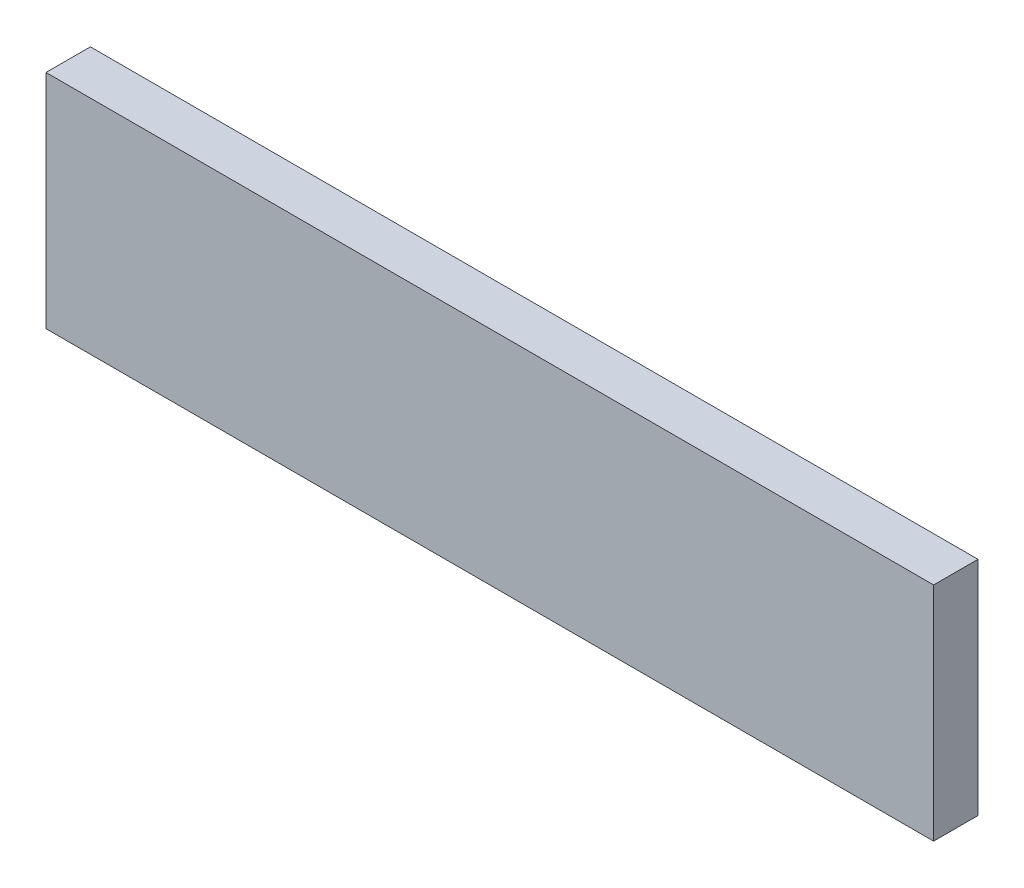
ISO-10303-21;
HEADER;
FILE_DESCRIPTION(('STEP AP214'),'2;1');
FILE_NAME('part.step','',(''),(''),'','','');
FILE_SCHEMA(('AUTOMOTIVE_DESIGN { 1 0 10303 214 1 1 1 1 }'));
ENDSEC;
DATA;
#1=APPLICATION_CONTEXT('core data for automotive mechanical design processes');
#2=APPLICATION_PROTOCOL_DEFINITION('international standard','automotive_design',2000,#1);
#3=PRODUCT_CONTEXT('',#1,'mechanical');
#4=PRODUCT('Part','Part','',(#3));
#5=PRODUCT_RELATED_PRODUCT_CATEGORY('part','',(#4));
#6=PRODUCT_DEFINITION_FORMATION('','',#4);
#7=PRODUCT_DEFINITION_CONTEXT('part definition',#1,'design');
#8=PRODUCT_DEFINITION('design','',#6,#7);
#9=PRODUCT_DEFINITION_SHAPE('','',#8);
#10=(LENGTH_UNIT() NAMED_UNIT(*) SI_UNIT(.MILLI.,.METRE.));
#11=(NAMED_UNIT(*) PLANE_ANGLE_UNIT() SI_UNIT($,.RADIAN.));
#12=(NAMED_UNIT(*) SI_UNIT($,.STERADIAN.) SOLID_ANGLE_UNIT());
#13=UNCERTAINTY_MEASURE_WITH_UNIT(LENGTH_MEASURE(1.E-05),#10,'distance_accuracy_value','');
#14=(GEOMETRIC_REPRESENTATION_CONTEXT(3) GLOBAL_UNCERTAINTY_ASSIGNED_CONTEXT((#13)) GLOBAL_UNIT_ASSIGNED_CONTEXT((#10,
#11,#12)) REPRESENTATION_CONTEXT('',''));
#15=CARTESIAN_POINT('',(0.,0.,0.));
#16=DIRECTION('',(0.,0.,1.));
#17=DIRECTION('',(1.,0.,0.));
#18=AXIS2_PLACEMENT_3D('',#15,#16,#17);
#19=CARTESIAN_POINT('',(0.,0.,4000.));
#20=DIRECTION('',(1.,0.,0.));
#21=DIRECTION('',(0.,0.,-1.));
#22=AXIS2_PLACEMENT_3D('',#19,#20,#21);
#23=PLANE('',#22);
#24=DIRECTION('',(0.,-1.,0.));
#25=VECTOR('',#24,1.);
#26=CARTESIAN_POINT('',(0.,0.,0.));
#27=LINE('',#26,#25);
#28=CARTESIAN_POINT('',(0.,20000.,0.));
#29=VERTEX_POINT('',#28);
#30=CARTESIAN_POINT('',(0.,0.,0.));
#31=VERTEX_POINT('',#30);
#32=EDGE_CURVE('E100',#29,#31,#27,.T.);
#33=ORIENTED_EDGE('',*,*,#32,.T.);
#34=DIRECTION('',(0.,0.,-1.));
#35=VECTOR('',#34,1.);
#36=CARTESIAN_POINT('',(0.,0.,4000.));
#37=LINE('',#36,#35);
#38=CARTESIAN_POINT('',(0.,0.,4000.));
#39=VERTEX_POINT('',#38);
#40=EDGE_CURVE('E11',#39,#31,#37,.T.);
#41=ORIENTED_EDGE('',*,*,#40,.F.);
#42=DIRECTION('',(0.,-1.,0.));
#43=VECTOR('',#42,1.);
#44=CARTESIAN_POINT('',(0.,0.,4000.));
#45=LINE('',#44,#43);
#46=CARTESIAN_POINT('',(0.,20000.,4000.));
#47=VERTEX_POINT('',#46);
#48=EDGE_CURVE('E88',#47,#39,#45,.T.);
#49=ORIENTED_EDGE('',*,*,#48,.F.);
#50=DIRECTION('',(0.,0.,-1.));
#51=VECTOR('',#50,1.);
#52=CARTESIAN_POINT('',(0.,20000.,4000.));
#53=LINE('',#52,#51);
#54=EDGE_CURVE('E96',#47,#29,#53,.T.);
#55=ORIENTED_EDGE('',*,*,#54,.T.);
#56=EDGE_LOOP('',(#33,#41,#49,#55));
#57=FACE_BOUND('',#56,.T.);
#58=ADVANCED_FACE('F37',(#57),#23,.F.);
#59=CARTESIAN_POINT('',(0.,0.,4000.));
#60=DIRECTION('',(0.,1.,0.));
#61=DIRECTION('',(0.,0.,1.));
#62=AXIS2_PLACEMENT_3D('',#59,#60,#61);
#63=PLANE('',#62);
#64=DIRECTION('',(1.,0.,0.));
#65=VECTOR('',#64,1.);
#66=CARTESIAN_POINT('',(0.,0.,0.));
#67=LINE('',#66,#65);
#68=CARTESIAN_POINT('',(80000.,0.,0.));
#69=VERTEX_POINT('',#68);
#70=EDGE_CURVE('E92',#31,#69,#67,.T.);
#71=ORIENTED_EDGE('',*,*,#70,.T.);
#72=DIRECTION('',(0.,0.,-1.));
#73=VECTOR('',#72,1.);
#74=CARTESIAN_POINT('',(80000.,0.,4000.));
#75=LINE('',#74,#73);
#76=CARTESIAN_POINT('',(80000.,0.,4000.));
#77=VERTEX_POINT('',#76);
#78=EDGE_CURVE('E45',#77,#69,#75,.T.);
#79=ORIENTED_EDGE('',*,*,#78,.F.);
#80=DIRECTION('',(1.,0.,0.));
#81=VECTOR('',#80,1.);
#82=CARTESIAN_POINT('',(0.,0.,4000.));
#83=LINE('',#82,#81);
#84=EDGE_CURVE('E83',#39,#77,#83,.T.);
#85=ORIENTED_EDGE('',*,*,#84,.F.);
#86=ORIENTED_EDGE('',*,*,#40,.T.);
#87=EDGE_LOOP('',(#71,#79,#85,#86));
#88=FACE_BOUND('',#87,.T.);
#89=ADVANCED_FACE('F91',(#88),#63,.F.);
#90=CARTESIAN_POINT('',(80000.,0.,4000.));
#91=DIRECTION('',(-1.,0.,0.));
#92=DIRECTION('',(0.,0.,1.));
#93=AXIS2_PLACEMENT_3D('',#90,#91,#92);
#94=PLANE('',#93);
#95=DIRECTION('',(0.,1.,0.));
#96=VECTOR('',#95,1.);
#97=CARTESIAN_POINT('',(80000.,0.,0.));
#98=LINE('',#97,#96);
#99=CARTESIAN_POINT('',(80000.,20000.,0.));
#100=VERTEX_POINT('',#99);
#101=EDGE_CURVE('E70',#69,#100,#98,.T.);
#102=ORIENTED_EDGE('',*,*,#101,.T.);
#103=DIRECTION('',(0.,0.,-1.));
#104=VECTOR('',#103,1.);
#105=CARTESIAN_POINT('',(80000.,20000.,4000.));
#106=LINE('',#105,#104);
#107=CARTESIAN_POINT('',(80000.,20000.,4000.));
#108=VERTEX_POINT('',#107);
#109=EDGE_CURVE('E93',#108,#100,#106,.T.);
#110=ORIENTED_EDGE('',*,*,#109,.F.);
#111=DIRECTION('',(0.,1.,0.));
#112=VECTOR('',#111,1.);
#113=CARTESIAN_POINT('',(80000.,0.,4000.));
#114=LINE('',#113,#112);
#115=EDGE_CURVE('E86',#77,#108,#114,.T.);
#116=ORIENTED_EDGE('',*,*,#115,.F.);
#117=ORIENTED_EDGE('',*,*,#78,.T.);
#118=EDGE_LOOP('',(#102,#110,#116,#117));
#119=FACE_BOUND('',#118,.T.);
#120=ADVANCED_FACE('F94',(#119),#94,.F.);
#121=CARTESIAN_POINT('',(0.,20000.,4000.));
#122=DIRECTION('',(0.,-1.,0.));
#123=DIRECTION('',(0.,0.,-1.));
#124=AXIS2_PLACEMENT_3D('',#121,#122,#123);
#125=PLANE('',#124);
#126=DIRECTION('',(-1.,0.,0.));
#127=VECTOR('',#126,1.);
#128=CARTESIAN_POINT('',(0.,20000.,0.));
#129=LINE('',#128,#127);
#130=EDGE_CURVE('E76',#100,#29,#129,.T.);
#131=ORIENTED_EDGE('',*,*,#130,.T.);
#132=ORIENTED_EDGE('',*,*,#54,.F.);
#133=DIRECTION('',(-1.,0.,0.));
#134=VECTOR('',#133,1.);
#135=CARTESIAN_POINT('',(0.,20000.,4000.));
#136=LINE('',#135,#134);
#137=EDGE_CURVE('E53',#108,#47,#136,.T.);
#138=ORIENTED_EDGE('',*,*,#137,.F.);
#139=ORIENTED_EDGE('',*,*,#109,.T.);
#140=EDGE_LOOP('',(#131,#132,#138,#139));
#141=FACE_BOUND('',#140,.T.);
#142=ADVANCED_FACE('F107',(#141),#125,.F.);
#143=CARTESIAN_POINT('',(0.,20000.,4000.));
#144=DIRECTION('',(0.,0.,-1.));
#145=DIRECTION('',(-1.,0.,0.));
#146=AXIS2_PLACEMENT_3D('',#143,#144,#145);
#147=PLANE('',#146);
#148=ORIENTED_EDGE('',*,*,#48,.T.);
#149=ORIENTED_EDGE('',*,*,#84,.T.);
#150=ORIENTED_EDGE('',*,*,#115,.T.);
#151=ORIENTED_EDGE('',*,*,#137,.T.);
#152=EDGE_LOOP('',(#148,#149,#150,#151));
#153=FACE_BOUND('',#152,.T.);
#154=ADVANCED_FACE('F84',(#153),#147,.F.);
#155=CARTESIAN_POINT('',(0.,20000.,0.));
#156=DIRECTION('',(0.,0.,-1.));
#157=DIRECTION('',(-1.,0.,0.));
#158=AXIS2_PLACEMENT_3D('',#155,#156,#157);
#159=PLANE('',#158);
#160=ORIENTED_EDGE('',*,*,#32,.F.);
#161=ORIENTED_EDGE('',*,*,#130,.F.);
#162=ORIENTED_EDGE('',*,*,#101,.F.);
#163=ORIENTED_EDGE('',*,*,#70,.F.);
#164=EDGE_LOOP('',(#160,#161,#162,#163));
#165=FACE_BOUND('',#164,.T.);
#166=ADVANCED_FACE('F110',(#165),#159,.T.);
#167=CLOSED_SHELL('',(#58,#89,#120,#142,#154,#166));
#168=MANIFOLD_SOLID_BREP('B2',#167);
#169=ADVANCED_BREP_SHAPE_REPRESENTATION('',(#18,#168),#14);
#170=SHAPE_DEFINITION_REPRESENTATION(#9,#169);
ENDSEC;
END-ISO-10303-21;
